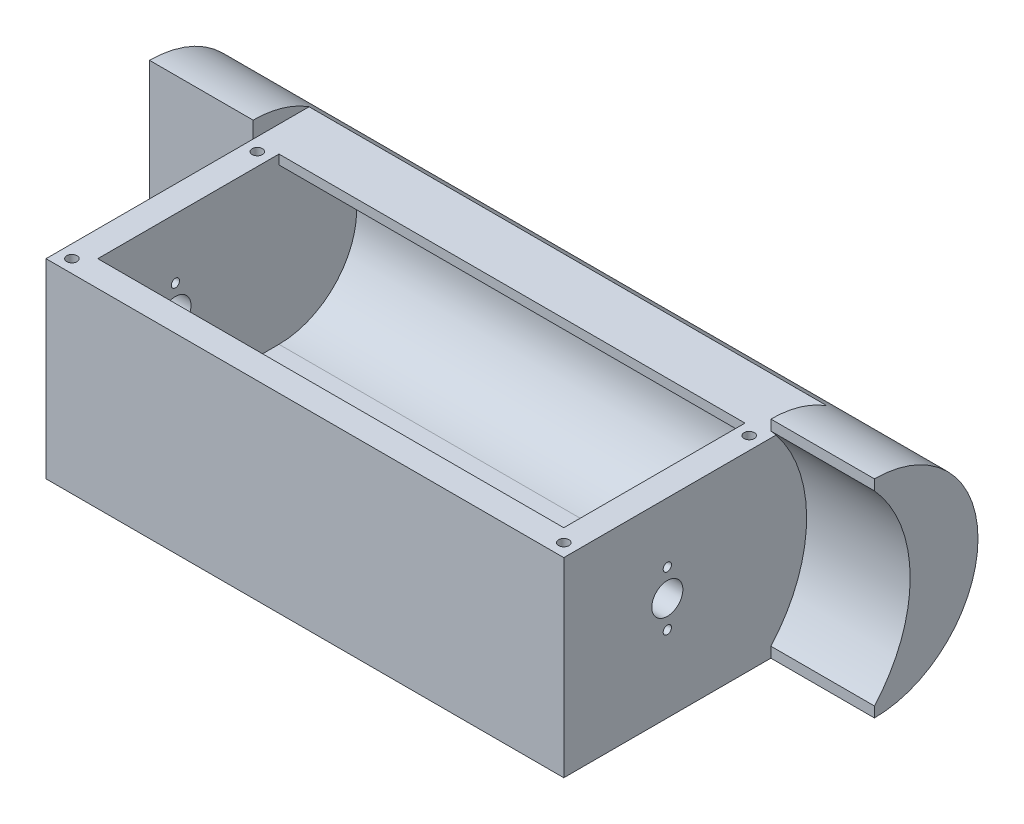
ISO-10303-21;
HEADER;
FILE_DESCRIPTION(('STEP AP214'),'2;1');
FILE_NAME('part.step','',(''),(''),'','','');
FILE_SCHEMA(('AUTOMOTIVE_DESIGN { 1 0 10303 214 1 1 1 1 }'));
ENDSEC;
DATA;
#1=APPLICATION_CONTEXT('core data for automotive mechanical design processes');
#2=APPLICATION_PROTOCOL_DEFINITION('international standard','automotive_design',2000,#1);
#3=PRODUCT_CONTEXT('',#1,'mechanical');
#4=PRODUCT('Part','Part','',(#3));
#5=PRODUCT_RELATED_PRODUCT_CATEGORY('part','',(#4));
#6=PRODUCT_DEFINITION_FORMATION('','',#4);
#7=PRODUCT_DEFINITION_CONTEXT('part definition',#1,'design');
#8=PRODUCT_DEFINITION('design','',#6,#7);
#9=PRODUCT_DEFINITION_SHAPE('','',#8);
#10=(LENGTH_UNIT() NAMED_UNIT(*) SI_UNIT(.MILLI.,.METRE.));
#11=(NAMED_UNIT(*) PLANE_ANGLE_UNIT() SI_UNIT($,.RADIAN.));
#12=(NAMED_UNIT(*) SI_UNIT($,.STERADIAN.) SOLID_ANGLE_UNIT());
#13=UNCERTAINTY_MEASURE_WITH_UNIT(LENGTH_MEASURE(1.E-05),#10,'distance_accuracy_value','');
#14=(GEOMETRIC_REPRESENTATION_CONTEXT(3) GLOBAL_UNCERTAINTY_ASSIGNED_CONTEXT((#13)) GLOBAL_UNIT_ASSIGNED_CONTEXT((#10,
#11,#12)) REPRESENTATION_CONTEXT('',''));
#15=CARTESIAN_POINT('',(0.,0.,0.));
#16=DIRECTION('',(0.,0.,1.));
#17=DIRECTION('',(1.,0.,0.));
#18=AXIS2_PLACEMENT_3D('',#15,#16,#17);
#19=CARTESIAN_POINT('',(120.,20.,-20.));
#20=DIRECTION('',(0.,0.,-1.));
#21=DIRECTION('',(0.,1.,0.));
#22=AXIS2_PLACEMENT_3D('',#19,#20,#21);
#23=PLANE('',#22);
#24=DIRECTION('',(0.,-1.,0.));
#25=VECTOR('',#24,1.);
#26=CARTESIAN_POINT('',(100.,20.,-20.));
#27=LINE('',#26,#25);
#28=CARTESIAN_POINT('',(100.,20.,-20.));
#29=VERTEX_POINT('',#28);
#30=CARTESIAN_POINT('',(100.,17.9891634046723,-20.));
#31=VERTEX_POINT('',#30);
#32=EDGE_CURVE('E189',#29,#31,#27,.T.);
#33=ORIENTED_EDGE('',*,*,#32,.T.);
#34=DIRECTION('',(1.,0.,0.));
#35=VECTOR('',#34,1.);
#36=CARTESIAN_POINT('',(63.365999399465,17.9891634046723,-20.));
#37=LINE('',#36,#35);
#38=CARTESIAN_POINT('',(120.,17.9891634046723,-20.));
#39=VERTEX_POINT('',#38);
#40=EDGE_CURVE('E171',#31,#39,#37,.T.);
#41=ORIENTED_EDGE('',*,*,#40,.T.);
#42=DIRECTION('',(0.,-1.,0.));
#43=VECTOR('',#42,1.);
#44=CARTESIAN_POINT('',(120.,20.,-20.));
#45=LINE('',#44,#43);
#46=CARTESIAN_POINT('',(120.,20.,-20.));
#47=VERTEX_POINT('',#46);
#48=EDGE_CURVE('E201',#47,#39,#45,.T.);
#49=ORIENTED_EDGE('',*,*,#48,.F.);
#50=DIRECTION('',(-1.,0.,0.));
#51=VECTOR('',#50,1.);
#52=CARTESIAN_POINT('',(120.,20.,-20.));
#53=LINE('',#52,#51);
#54=EDGE_CURVE('E206',#47,#29,#53,.T.);
#55=ORIENTED_EDGE('',*,*,#54,.T.);
#56=EDGE_LOOP('',(#33,#41,#49,#55));
#57=FACE_BOUND('',#56,.T.);
#58=ADVANCED_FACE('F49',(#57),#23,.F.);
#59=CARTESIAN_POINT('',(0.,0.,-20.));
#60=DIRECTION('',(-1.,0.,0.));
#61=DIRECTION('',(0.,0.,1.));
#62=AXIS2_PLACEMENT_3D('',#59,#60,#61);
#63=PLANE('',#62);
#64=CARTESIAN_POINT('',(0.,-5.25,0.));
#65=DIRECTION('',(-1.,0.,0.));
#66=DIRECTION('',(0.,0.,1.));
#67=AXIS2_PLACEMENT_3D('',#64,#65,#66);
#68=CIRCLE('',#67,0.8);
#69=CARTESIAN_POINT('',(0.,-5.25,0.799999999999998));
#70=VERTEX_POINT('',#69);
#71=EDGE_CURVE('E276',#70,#70,#68,.F.);
#72=ORIENTED_EDGE('',*,*,#71,.T.);
#73=EDGE_LOOP('',(#72));
#74=FACE_BOUND('',#73,.T.);
#75=CARTESIAN_POINT('',(0.,0.,0.));
#76=DIRECTION('',(-1.,0.,0.));
#77=DIRECTION('',(0.,0.,1.));
#78=AXIS2_PLACEMENT_3D('',#75,#76,#77);
#79=CIRCLE('',#78,3.);
#80=CARTESIAN_POINT('',(0.,0.,3.));
#81=VERTEX_POINT('',#80);
#82=EDGE_CURVE('E410',#81,#81,#79,.F.);
#83=ORIENTED_EDGE('',*,*,#82,.T.);
#84=EDGE_LOOP('',(#83));
#85=FACE_BOUND('',#84,.T.);
#86=CARTESIAN_POINT('',(0.,5.25,0.));
#87=DIRECTION('',(-1.,0.,0.));
#88=DIRECTION('',(0.,0.,1.));
#89=AXIS2_PLACEMENT_3D('',#86,#87,#88);
#90=CIRCLE('',#89,0.8);
#91=CARTESIAN_POINT('',(0.,5.25,0.799999999999998));
#92=VERTEX_POINT('',#91);
#93=EDGE_CURVE('E398',#92,#92,#90,.F.);
#94=ORIENTED_EDGE('',*,*,#93,.T.);
#95=EDGE_LOOP('',(#94));
#96=FACE_BOUND('',#95,.T.);
#97=DIRECTION('',(0.,-1.,0.));
#98=VECTOR('',#97,1.);
#99=CARTESIAN_POINT('',(0.,20.,20.));
#100=LINE('',#99,#98);
#101=CARTESIAN_POINT('',(0.,16.825,20.));
#102=VERTEX_POINT('',#101);
#103=CARTESIAN_POINT('',(0.,-20.,20.));
#104=VERTEX_POINT('',#103);
#105=EDGE_CURVE('E243',#102,#104,#100,.T.);
#106=ORIENTED_EDGE('',*,*,#105,.F.);
#107=DIRECTION('',(0.,0.,1.));
#108=VECTOR('',#107,1.);
#109=CARTESIAN_POINT('',(0.,16.825,-30.81));
#110=LINE('',#109,#108);
#111=CARTESIAN_POINT('',(0.,16.825,-20.));
#112=VERTEX_POINT('',#111);
#113=EDGE_CURVE('E299',#112,#102,#110,.T.);
#114=ORIENTED_EDGE('',*,*,#113,.F.);
#115=DIRECTION('',(0.,-1.,0.));
#116=VECTOR('',#115,1.);
#117=CARTESIAN_POINT('',(0.,20.,-20.));
#118=LINE('',#117,#116);
#119=CARTESIAN_POINT('',(0.,-20.,-20.));
#120=VERTEX_POINT('',#119);
#121=EDGE_CURVE('E341',#112,#120,#118,.T.);
#122=ORIENTED_EDGE('',*,*,#121,.T.);
#123=DIRECTION('',(0.,0.,-1.));
#124=VECTOR('',#123,1.);
#125=CARTESIAN_POINT('',(0.,-20.,20.));
#126=LINE('',#125,#124);
#127=EDGE_CURVE('E254',#104,#120,#126,.T.);
#128=ORIENTED_EDGE('',*,*,#127,.F.);
#129=EDGE_LOOP('',(#106,#114,#122,#128));
#130=FACE_BOUND('',#129,.T.);
#131=ADVANCED_FACE('F427',(#74,#85,#96,#130),#63,.T.);
#132=CARTESIAN_POINT('',(100.,0.,-20.));
#133=DIRECTION('',(-1.,0.,0.));
#134=DIRECTION('',(0.,0.,1.));
#135=AXIS2_PLACEMENT_3D('',#132,#133,#134);
#136=PLANE('',#135);
#137=CARTESIAN_POINT('',(100.,-5.25,0.));
#138=DIRECTION('',(1.,0.,0.));
#139=DIRECTION('',(0.,0.,1.));
#140=AXIS2_PLACEMENT_3D('',#137,#138,#139);
#141=CIRCLE('',#140,0.8);
#142=CARTESIAN_POINT('',(100.,-5.25,0.799999999999998));
#143=VERTEX_POINT('',#142);
#144=EDGE_CURVE('E402',#143,#143,#141,.T.);
#145=ORIENTED_EDGE('',*,*,#144,.F.);
#146=EDGE_LOOP('',(#145));
#147=FACE_BOUND('',#146,.T.);
#148=CARTESIAN_POINT('',(100.,0.,0.));
#149=DIRECTION('',(1.,0.,0.));
#150=DIRECTION('',(0.,0.,-1.));
#151=AXIS2_PLACEMENT_3D('',#148,#149,#150);
#152=CIRCLE('',#151,3.);
#153=CARTESIAN_POINT('',(100.,0.,-3.));
#154=VERTEX_POINT('',#153);
#155=EDGE_CURVE('E406',#154,#154,#152,.T.);
#156=ORIENTED_EDGE('',*,*,#155,.F.);
#157=EDGE_LOOP('',(#156));
#158=FACE_BOUND('',#157,.T.);
#159=CARTESIAN_POINT('',(100.,5.25,0.));
#160=DIRECTION('',(1.,0.,0.));
#161=DIRECTION('',(0.,0.,-1.));
#162=AXIS2_PLACEMENT_3D('',#159,#160,#161);
#163=CIRCLE('',#162,0.8);
#164=CARTESIAN_POINT('',(100.,5.25,-0.800000000000002));
#165=VERTEX_POINT('',#164);
#166=EDGE_CURVE('E292',#165,#165,#163,.T.);
#167=ORIENTED_EDGE('',*,*,#166,.F.);
#168=EDGE_LOOP('',(#167));
#169=FACE_BOUND('',#168,.T.);
#170=DIRECTION('',(0.,0.,-1.));
#171=VECTOR('',#170,1.);
#172=CARTESIAN_POINT('',(100.,16.825,-30.81));
#173=LINE('',#172,#171);
#174=CARTESIAN_POINT('',(100.,16.825,20.));
#175=VERTEX_POINT('',#174);
#176=CARTESIAN_POINT('',(100.,16.825,-20.9887916517364));
#177=VERTEX_POINT('',#176);
#178=EDGE_CURVE('E311',#175,#177,#173,.T.);
#179=ORIENTED_EDGE('',*,*,#178,.F.);
#180=DIRECTION('',(0.,-1.,0.));
#181=VECTOR('',#180,1.);
#182=CARTESIAN_POINT('',(100.,20.,20.));
#183=LINE('',#182,#181);
#184=CARTESIAN_POINT('',(100.,-20.,20.));
#185=VERTEX_POINT('',#184);
#186=EDGE_CURVE('E251',#175,#185,#183,.T.);
#187=ORIENTED_EDGE('',*,*,#186,.T.);
#188=DIRECTION('',(0.,0.,-1.));
#189=VECTOR('',#188,1.);
#190=CARTESIAN_POINT('',(100.,-20.,20.));
#191=LINE('',#190,#189);
#192=CARTESIAN_POINT('',(100.,-20.,-20.));
#193=VERTEX_POINT('',#192);
#194=EDGE_CURVE('E186',#185,#193,#191,.T.);
#195=ORIENTED_EDGE('',*,*,#194,.T.);
#196=CARTESIAN_POINT('',(100.,-17.9891634046723,-20.));
#197=VERTEX_POINT('',#196);
#198=EDGE_CURVE('E177',#197,#193,#27,.T.);
#199=ORIENTED_EDGE('',*,*,#198,.F.);
#200=CARTESIAN_POINT('',(100.,0.,0.));
#201=DIRECTION('',(-1.,0.,0.));
#202=DIRECTION('',(0.,0.,1.));
#203=AXIS2_PLACEMENT_3D('',#200,#201,#202);
#204=CIRCLE('',#203,26.9);
#205=EDGE_CURVE('E67',#197,#177,#204,.F.);
#206=ORIENTED_EDGE('',*,*,#205,.T.);
#207=EDGE_LOOP('',(#179,#187,#195,#199,#206));
#208=FACE_BOUND('',#207,.T.);
#209=ADVANCED_FACE('F184',(#147,#158,#169,#208),#136,.F.);
#210=CARTESIAN_POINT('',(100.,20.,20.));
#211=DIRECTION('',(0.,0.,-1.));
#212=DIRECTION('',(0.,1.,0.));
#213=AXIS2_PLACEMENT_3D('',#210,#211,#212);
#214=PLANE('',#213);
#215=DIRECTION('',(1.,0.,0.));
#216=VECTOR('',#215,1.);
#217=CARTESIAN_POINT('',(0.,16.825,20.));
#218=LINE('',#217,#216);
#219=EDGE_CURVE('E304',#102,#175,#218,.T.);
#220=ORIENTED_EDGE('',*,*,#219,.F.);
#221=ORIENTED_EDGE('',*,*,#105,.T.);
#222=DIRECTION('',(-1.,0.,0.));
#223=VECTOR('',#222,1.);
#224=CARTESIAN_POINT('',(100.,-20.,20.));
#225=LINE('',#224,#223);
#226=EDGE_CURVE('E266',#185,#104,#225,.T.);
#227=ORIENTED_EDGE('',*,*,#226,.F.);
#228=ORIENTED_EDGE('',*,*,#186,.F.);
#229=EDGE_LOOP('',(#220,#221,#227,#228));
#230=FACE_BOUND('',#229,.T.);
#231=ADVANCED_FACE('F51',(#230),#214,.F.);
#232=CARTESIAN_POINT('',(100.,-20.,20.));
#233=DIRECTION('',(0.,1.,0.));
#234=DIRECTION('',(0.,0.,1.));
#235=AXIS2_PLACEMENT_3D('',#232,#233,#234);
#236=PLANE('',#235);
#237=ORIENTED_EDGE('',*,*,#127,.T.);
#238=DIRECTION('',(-1.,0.,0.));
#239=VECTOR('',#238,1.);
#240=CARTESIAN_POINT('',(100.,-20.,-20.));
#241=LINE('',#240,#239);
#242=EDGE_CURVE('E257',#193,#120,#241,.T.);
#243=ORIENTED_EDGE('',*,*,#242,.F.);
#244=ORIENTED_EDGE('',*,*,#194,.F.);
#245=ORIENTED_EDGE('',*,*,#226,.T.);
#246=EDGE_LOOP('',(#237,#243,#244,#245));
#247=FACE_BOUND('',#246,.T.);
#248=ADVANCED_FACE('F434',(#247),#236,.F.);
#249=CARTESIAN_POINT('',(100.,0.,-20.));
#250=DIRECTION('',(-1.,0.,0.));
#251=DIRECTION('',(0.,0.,1.));
#252=AXIS2_PLACEMENT_3D('',#249,#250,#251);
#253=CYLINDRICAL_SURFACE('',#252,20.);
#254=DIRECTION('',(1.,0.,0.));
#255=VECTOR('',#254,1.);
#256=CARTESIAN_POINT('',(-20.,20.,-20.));
#257=LINE('',#256,#255);
#258=CARTESIAN_POINT('',(-20.,20.,-20.));
#259=VERTEX_POINT('',#258);
#260=CARTESIAN_POINT('',(0.,20.,-20.));
#261=VERTEX_POINT('',#260);
#262=EDGE_CURVE('E197',#259,#261,#257,.T.);
#263=ORIENTED_EDGE('',*,*,#262,.T.);
#264=CARTESIAN_POINT('',(0.,0.,-20.));
#265=DIRECTION('',(-1.,0.,0.));
#266=DIRECTION('',(0.,0.,1.));
#267=AXIS2_PLACEMENT_3D('',#264,#265,#266);
#268=CIRCLE('',#267,20.);
#269=CARTESIAN_POINT('',(0.,16.8268802812643,-30.81));
#270=VERTEX_POINT('',#269);
#271=EDGE_CURVE('E321',#261,#270,#268,.T.);
#272=ORIENTED_EDGE('',*,*,#271,.T.);
#273=DIRECTION('',(-1.,0.,0.));
#274=VECTOR('',#273,1.);
#275=CARTESIAN_POINT('',(100.,16.8268802812643,-30.81));
#276=LINE('',#275,#274);
#277=CARTESIAN_POINT('',(100.,16.8268802812643,-30.81));
#278=VERTEX_POINT('',#277);
#279=EDGE_CURVE('E12',#270,#278,#276,.F.);
#280=ORIENTED_EDGE('',*,*,#279,.T.);
#281=CARTESIAN_POINT('',(100.,0.,-20.));
#282=DIRECTION('',(1.,0.,0.));
#283=DIRECTION('',(0.,0.,-1.));
#284=AXIS2_PLACEMENT_3D('',#281,#282,#283);
#285=CIRCLE('',#284,20.);
#286=EDGE_CURVE('E328',#278,#29,#285,.T.);
#287=ORIENTED_EDGE('',*,*,#286,.T.);
#288=ORIENTED_EDGE('',*,*,#54,.F.);
#289=CARTESIAN_POINT('',(120.,0.,-20.));
#290=DIRECTION('',(1.,0.,0.));
#291=DIRECTION('',(0.,0.,1.));
#292=AXIS2_PLACEMENT_3D('',#289,#290,#291);
#293=CIRCLE('',#292,20.);
#294=CARTESIAN_POINT('',(120.,-20.,-20.));
#295=VERTEX_POINT('',#294);
#296=EDGE_CURVE('E195',#295,#47,#293,.T.);
#297=ORIENTED_EDGE('',*,*,#296,.F.);
#298=DIRECTION('',(-1.,0.,0.));
#299=VECTOR('',#298,1.);
#300=CARTESIAN_POINT('',(120.,-20.,-20.));
#301=LINE('',#300,#299);
#302=EDGE_CURVE('E203',#295,#193,#301,.T.);
#303=ORIENTED_EDGE('',*,*,#302,.T.);
#304=ORIENTED_EDGE('',*,*,#242,.T.);
#305=DIRECTION('',(1.,0.,0.));
#306=VECTOR('',#305,1.);
#307=CARTESIAN_POINT('',(-20.,-20.,-20.));
#308=LINE('',#307,#306);
#309=CARTESIAN_POINT('',(-20.,-20.,-20.));
#310=VERTEX_POINT('',#309);
#311=EDGE_CURVE('E190',#310,#120,#308,.T.);
#312=ORIENTED_EDGE('',*,*,#311,.F.);
#313=CARTESIAN_POINT('',(-20.,0.,-20.));
#314=DIRECTION('',(1.,0.,0.));
#315=DIRECTION('',(0.,0.,1.));
#316=AXIS2_PLACEMENT_3D('',#313,#314,#315);
#317=CIRCLE('',#316,20.);
#318=EDGE_CURVE('E342',#310,#259,#317,.T.);
#319=ORIENTED_EDGE('',*,*,#318,.T.);
#320=EDGE_LOOP('',(#263,#272,#280,#287,#288,#297,#303,#304,#312,#319));
#321=FACE_BOUND('',#320,.T.);
#322=ADVANCED_FACE('F448',(#321),#253,.T.);
#323=CARTESIAN_POINT('',(120.,-17.9891634046723,-20.));
#324=VERTEX_POINT('',#323);
#325=EDGE_CURVE('E179',#324,#295,#45,.T.);
#326=ORIENTED_EDGE('',*,*,#325,.F.);
#327=DIRECTION('',(1.,0.,0.));
#328=VECTOR('',#327,1.);
#329=CARTESIAN_POINT('',(63.365999399465,-17.9891634046723,-20.));
#330=LINE('',#329,#328);
#331=EDGE_CURVE('E165',#197,#324,#330,.T.);
#332=ORIENTED_EDGE('',*,*,#331,.F.);
#333=ORIENTED_EDGE('',*,*,#198,.T.);
#334=ORIENTED_EDGE('',*,*,#302,.F.);
#335=EDGE_LOOP('',(#326,#332,#333,#334));
#336=FACE_BOUND('',#335,.T.);
#337=ADVANCED_FACE('F175',(#336),#23,.F.);
#338=CARTESIAN_POINT('',(120.,0.,-20.));
#339=DIRECTION('',(-1.,0.,0.));
#340=DIRECTION('',(0.,0.,1.));
#341=AXIS2_PLACEMENT_3D('',#338,#339,#340);
#342=PLANE('',#341);
#343=ORIENTED_EDGE('',*,*,#48,.T.);
#344=CARTESIAN_POINT('',(120.,0.,0.));
#345=DIRECTION('',(1.,0.,0.));
#346=DIRECTION('',(0.,0.,-1.));
#347=AXIS2_PLACEMENT_3D('',#344,#345,#346);
#348=CIRCLE('',#347,26.9);
#349=EDGE_CURVE('E181',#324,#39,#348,.T.);
#350=ORIENTED_EDGE('',*,*,#349,.F.);
#351=ORIENTED_EDGE('',*,*,#325,.T.);
#352=ORIENTED_EDGE('',*,*,#296,.T.);
#353=EDGE_LOOP('',(#343,#350,#351,#352));
#354=FACE_BOUND('',#353,.T.);
#355=ADVANCED_FACE('F363',(#354),#342,.F.);
#356=CARTESIAN_POINT('',(-20.,20.,-20.));
#357=DIRECTION('',(0.,0.,1.));
#358=DIRECTION('',(0.,-1.,0.));
#359=AXIS2_PLACEMENT_3D('',#356,#357,#358);
#360=PLANE('',#359);
#361=EDGE_CURVE('E347',#261,#112,#118,.T.);
#362=ORIENTED_EDGE('',*,*,#361,.F.);
#363=ORIENTED_EDGE('',*,*,#262,.F.);
#364=DIRECTION('',(0.,-1.,0.));
#365=VECTOR('',#364,1.);
#366=CARTESIAN_POINT('',(-20.,20.,-20.));
#367=LINE('',#366,#365);
#368=EDGE_CURVE('E346',#259,#310,#367,.T.);
#369=ORIENTED_EDGE('',*,*,#368,.T.);
#370=ORIENTED_EDGE('',*,*,#311,.T.);
#371=ORIENTED_EDGE('',*,*,#121,.F.);
#372=EDGE_LOOP('',(#362,#363,#369,#370,#371));
#373=FACE_BOUND('',#372,.T.);
#374=ADVANCED_FACE('F453',(#373),#360,.T.);
#375=CARTESIAN_POINT('',(-20.,0.,-20.));
#376=DIRECTION('',(1.,0.,0.));
#377=DIRECTION('',(0.,0.,1.));
#378=AXIS2_PLACEMENT_3D('',#375,#376,#377);
#379=PLANE('',#378);
#380=ORIENTED_EDGE('',*,*,#318,.F.);
#381=ORIENTED_EDGE('',*,*,#368,.F.);
#382=EDGE_LOOP('',(#380,#381));
#383=FACE_BOUND('',#382,.T.);
#384=ADVANCED_FACE('F555',(#383),#379,.F.);
#385=CARTESIAN_POINT('',(0.,16.825,-30.81));
#386=DIRECTION('',(0.,0.,-1.));
#387=DIRECTION('',(-1.,0.,0.));
#388=AXIS2_PLACEMENT_3D('',#385,#386,#387);
#389=PLANE('',#388);
#390=DIRECTION('',(0.,1.,0.));
#391=VECTOR('',#390,1.);
#392=CARTESIAN_POINT('',(0.,16.825,-30.81));
#393=LINE('',#392,#391);
#394=CARTESIAN_POINT('',(0.,16.825,-30.81));
#395=VERTEX_POINT('',#394);
#396=EDGE_CURVE('E317',#395,#270,#393,.T.);
#397=ORIENTED_EDGE('',*,*,#396,.F.);
#398=DIRECTION('',(-1.,0.,0.));
#399=VECTOR('',#398,1.);
#400=CARTESIAN_POINT('',(0.,16.825,-30.81));
#401=LINE('',#400,#399);
#402=CARTESIAN_POINT('',(100.,16.825,-30.81));
#403=VERTEX_POINT('',#402);
#404=EDGE_CURVE('E312',#403,#395,#401,.T.);
#405=ORIENTED_EDGE('',*,*,#404,.F.);
#406=DIRECTION('',(0.,1.,0.));
#407=VECTOR('',#406,1.);
#408=CARTESIAN_POINT('',(100.,16.825,-30.81));
#409=LINE('',#408,#407);
#410=EDGE_CURVE('E316',#403,#278,#409,.T.);
#411=ORIENTED_EDGE('',*,*,#410,.T.);
#412=ORIENTED_EDGE('',*,*,#279,.F.);
#413=EDGE_LOOP('',(#397,#405,#411,#412));
#414=FACE_BOUND('',#413,.T.);
#415=ADVANCED_FACE('F552',(#414),#389,.F.);
#416=CARTESIAN_POINT('',(100.,16.825,-30.81));
#417=DIRECTION('',(1.,0.,0.));
#418=DIRECTION('',(0.,0.,-1.));
#419=AXIS2_PLACEMENT_3D('',#416,#417,#418);
#420=PLANE('',#419);
#421=EDGE_CURVE('E308',#177,#403,#173,.T.);
#422=ORIENTED_EDGE('',*,*,#421,.F.);
#423=EDGE_CURVE('E168',#177,#31,#204,.F.);
#424=ORIENTED_EDGE('',*,*,#423,.T.);
#425=ORIENTED_EDGE('',*,*,#32,.F.);
#426=ORIENTED_EDGE('',*,*,#286,.F.);
#427=ORIENTED_EDGE('',*,*,#410,.F.);
#428=EDGE_LOOP('',(#422,#424,#425,#426,#427));
#429=FACE_BOUND('',#428,.T.);
#430=ADVANCED_FACE('F547',(#429),#420,.F.);
#431=CARTESIAN_POINT('',(0.,16.825,-30.81));
#432=DIRECTION('',(-1.,0.,0.));
#433=DIRECTION('',(0.,0.,1.));
#434=AXIS2_PLACEMENT_3D('',#431,#432,#433);
#435=PLANE('',#434);
#436=ORIENTED_EDGE('',*,*,#361,.T.);
#437=EDGE_CURVE('E300',#395,#112,#110,.T.);
#438=ORIENTED_EDGE('',*,*,#437,.F.);
#439=ORIENTED_EDGE('',*,*,#396,.T.);
#440=ORIENTED_EDGE('',*,*,#271,.F.);
#441=EDGE_LOOP('',(#436,#438,#439,#440));
#442=FACE_BOUND('',#441,.T.);
#443=ADVANCED_FACE('F467',(#442),#435,.F.);
#444=CARTESIAN_POINT('',(0.,16.825,0.));
#445=DIRECTION('',(0.,1.,0.));
#446=DIRECTION('',(0.,0.,1.));
#447=AXIS2_PLACEMENT_3D('',#444,#445,#446);
#448=PLANE('',#447);
#449=CARTESIAN_POINT('',(97.5,16.825,-18.31));
#450=DIRECTION('',(0.,1.,0.));
#451=DIRECTION('',(0.,0.,1.));
#452=AXIS2_PLACEMENT_3D('',#449,#450,#451);
#453=CIRCLE('',#452,0.999999999999998);
#454=CARTESIAN_POINT('',(97.5,16.825,-17.31));
#455=VERTEX_POINT('',#454);
#456=EDGE_CURVE('E378',#455,#455,#453,.T.);
#457=ORIENTED_EDGE('',*,*,#456,.F.);
#458=EDGE_LOOP('',(#457));
#459=FACE_BOUND('',#458,.T.);
#460=CARTESIAN_POINT('',(2.50000000000002,16.825,17.5));
#461=DIRECTION('',(0.,1.,0.));
#462=DIRECTION('',(0.,0.,-1.));
#463=AXIS2_PLACEMENT_3D('',#460,#461,#462);
#464=CIRCLE('',#463,0.999999999999999);
#465=CARTESIAN_POINT('',(2.50000000000002,16.825,16.5));
#466=VERTEX_POINT('',#465);
#467=EDGE_CURVE('E387',#466,#466,#464,.T.);
#468=ORIENTED_EDGE('',*,*,#467,.F.);
#469=EDGE_LOOP('',(#468));
#470=FACE_BOUND('',#469,.T.);
#471=CARTESIAN_POINT('',(2.50000000000002,16.825,-18.31));
#472=DIRECTION('',(0.,1.,0.));
#473=DIRECTION('',(0.,0.,-1.));
#474=AXIS2_PLACEMENT_3D('',#471,#472,#473);
#475=CIRCLE('',#474,0.999999999999999);
#476=CARTESIAN_POINT('',(2.50000000000002,16.825,-19.31));
#477=VERTEX_POINT('',#476);
#478=EDGE_CURVE('E371',#477,#477,#475,.T.);
#479=ORIENTED_EDGE('',*,*,#478,.F.);
#480=EDGE_LOOP('',(#479));
#481=FACE_BOUND('',#480,.T.);
#482=CARTESIAN_POINT('',(97.5,16.825,17.5));
#483=DIRECTION('',(0.,1.,0.));
#484=DIRECTION('',(0.,0.,1.));
#485=AXIS2_PLACEMENT_3D('',#482,#483,#484);
#486=CIRCLE('',#485,0.999999999999998);
#487=CARTESIAN_POINT('',(97.5,16.825,18.5));
#488=VERTEX_POINT('',#487);
#489=EDGE_CURVE('E382',#488,#488,#486,.T.);
#490=ORIENTED_EDGE('',*,*,#489,.F.);
#491=EDGE_LOOP('',(#490));
#492=FACE_BOUND('',#491,.T.);
#493=DIRECTION('',(1.,0.,0.));
#494=VECTOR('',#493,1.);
#495=CARTESIAN_POINT('',(100.,16.825,15.));
#496=LINE('',#495,#494);
#497=CARTESIAN_POINT('',(5.,16.825,15.));
#498=VERTEX_POINT('',#497);
#499=CARTESIAN_POINT('',(95.,16.825,15.));
#500=VERTEX_POINT('',#499);
#501=EDGE_CURVE('E75',#498,#500,#496,.T.);
#502=ORIENTED_EDGE('',*,*,#501,.F.);
#503=DIRECTION('',(0.,0.,-1.));
#504=VECTOR('',#503,1.);
#505=CARTESIAN_POINT('',(5.,16.825,-20.));
#506=LINE('',#505,#504);
#507=CARTESIAN_POINT('',(5.,16.825,-20.));
#508=VERTEX_POINT('',#507);
#509=EDGE_CURVE('E59',#498,#508,#506,.T.);
#510=ORIENTED_EDGE('',*,*,#509,.T.);
#511=DIRECTION('',(-1.,0.,0.));
#512=VECTOR('',#511,1.);
#513=CARTESIAN_POINT('',(100.,16.825,-20.));
#514=LINE('',#513,#512);
#515=CARTESIAN_POINT('',(95.,16.825,-20.));
#516=VERTEX_POINT('',#515);
#517=EDGE_CURVE('E334',#508,#516,#514,.F.);
#518=ORIENTED_EDGE('',*,*,#517,.T.);
#519=DIRECTION('',(0.,0.,-1.));
#520=VECTOR('',#519,1.);
#521=CARTESIAN_POINT('',(95.,16.825,-20.));
#522=LINE('',#521,#520);
#523=EDGE_CURVE('E337',#500,#516,#522,.T.);
#524=ORIENTED_EDGE('',*,*,#523,.F.);
#525=EDGE_LOOP('',(#502,#510,#518,#524));
#526=FACE_BOUND('',#525,.T.);
#527=ORIENTED_EDGE('',*,*,#437,.T.);
#528=ORIENTED_EDGE('',*,*,#113,.T.);
#529=ORIENTED_EDGE('',*,*,#219,.T.);
#530=ORIENTED_EDGE('',*,*,#178,.T.);
#531=ORIENTED_EDGE('',*,*,#421,.T.);
#532=ORIENTED_EDGE('',*,*,#404,.T.);
#533=EDGE_LOOP('',(#527,#528,#529,#530,#531,#532));
#534=FACE_BOUND('',#533,.T.);
#535=ADVANCED_FACE('F470',(#459,#470,#481,#492,#526,#534),#448,.T.);
#536=CARTESIAN_POINT('',(100.,0.,-20.));
#537=DIRECTION('',(-1.,0.,0.));
#538=DIRECTION('',(0.,0.,1.));
#539=AXIS2_PLACEMENT_3D('',#536,#537,#538);
#540=CYLINDRICAL_SURFACE('',#539,15.);
#541=CARTESIAN_POINT('',(5.,0.,-20.));
#542=DIRECTION('',(-1.,0.,0.));
#543=DIRECTION('',(0.,0.,1.));
#544=AXIS2_PLACEMENT_3D('',#541,#542,#543);
#545=CIRCLE('',#544,15.);
#546=CARTESIAN_POINT('',(5.,-15.,-20.));
#547=VERTEX_POINT('',#546);
#548=CARTESIAN_POINT('',(5.,15.,-20.));
#549=VERTEX_POINT('',#548);
#550=EDGE_CURVE('E224',#547,#549,#545,.F.);
#551=ORIENTED_EDGE('',*,*,#550,.F.);
#552=DIRECTION('',(-1.,0.,0.));
#553=VECTOR('',#552,1.);
#554=CARTESIAN_POINT('',(100.,-15.,-20.));
#555=LINE('',#554,#553);
#556=CARTESIAN_POINT('',(95.,-15.,-20.));
#557=VERTEX_POINT('',#556);
#558=EDGE_CURVE('E219',#557,#547,#555,.T.);
#559=ORIENTED_EDGE('',*,*,#558,.F.);
#560=CARTESIAN_POINT('',(95.,0.,-20.));
#561=DIRECTION('',(-1.,0.,0.));
#562=DIRECTION('',(0.,0.,1.));
#563=AXIS2_PLACEMENT_3D('',#560,#561,#562);
#564=CIRCLE('',#563,15.);
#565=CARTESIAN_POINT('',(95.,15.,-20.));
#566=VERTEX_POINT('',#565);
#567=EDGE_CURVE('E230',#557,#566,#564,.F.);
#568=ORIENTED_EDGE('',*,*,#567,.T.);
#569=DIRECTION('',(-1.,0.,0.));
#570=VECTOR('',#569,1.);
#571=CARTESIAN_POINT('',(50.,15.,-20.));
#572=LINE('',#571,#570);
#573=EDGE_CURVE('E218',#566,#549,#572,.T.);
#574=ORIENTED_EDGE('',*,*,#573,.T.);
#575=EDGE_LOOP('',(#551,#559,#568,#574));
#576=FACE_BOUND('',#575,.T.);
#577=ADVANCED_FACE('F534',(#576),#540,.F.);
#578=CARTESIAN_POINT('',(100.,-15.,20.));
#579=DIRECTION('',(0.,1.,0.));
#580=DIRECTION('',(0.,0.,1.));
#581=AXIS2_PLACEMENT_3D('',#578,#579,#580);
#582=PLANE('',#581);
#583=DIRECTION('',(0.,0.,-1.));
#584=VECTOR('',#583,1.);
#585=CARTESIAN_POINT('',(5.,-15.,-20.));
#586=LINE('',#585,#584);
#587=CARTESIAN_POINT('',(5.,-15.,15.));
#588=VERTEX_POINT('',#587);
#589=EDGE_CURVE('E213',#588,#547,#586,.T.);
#590=ORIENTED_EDGE('',*,*,#589,.F.);
#591=DIRECTION('',(-1.,0.,0.));
#592=VECTOR('',#591,1.);
#593=CARTESIAN_POINT('',(100.,-15.,15.));
#594=LINE('',#593,#592);
#595=CARTESIAN_POINT('',(95.,-15.,15.));
#596=VERTEX_POINT('',#595);
#597=EDGE_CURVE('E214',#596,#588,#594,.T.);
#598=ORIENTED_EDGE('',*,*,#597,.F.);
#599=DIRECTION('',(0.,0.,-1.));
#600=VECTOR('',#599,1.);
#601=CARTESIAN_POINT('',(95.,-15.,-20.));
#602=LINE('',#601,#600);
#603=EDGE_CURVE('E223',#596,#557,#602,.T.);
#604=ORIENTED_EDGE('',*,*,#603,.T.);
#605=ORIENTED_EDGE('',*,*,#558,.T.);
#606=EDGE_LOOP('',(#590,#598,#604,#605));
#607=FACE_BOUND('',#606,.T.);
#608=ADVANCED_FACE('F516',(#607),#582,.T.);
#609=CARTESIAN_POINT('',(95.,0.,-20.));
#610=DIRECTION('',(-1.,0.,0.));
#611=DIRECTION('',(0.,0.,1.));
#612=AXIS2_PLACEMENT_3D('',#609,#610,#611);
#613=PLANE('',#612);
#614=CARTESIAN_POINT('',(95.,-5.25,0.));
#615=DIRECTION('',(-1.,0.,0.));
#616=DIRECTION('',(0.,0.,1.));
#617=AXIS2_PLACEMENT_3D('',#614,#615,#616);
#618=CIRCLE('',#617,0.8);
#619=CARTESIAN_POINT('',(95.,-5.25,0.799999999999998));
#620=VERTEX_POINT('',#619);
#621=EDGE_CURVE('E295',#620,#620,#618,.T.);
#622=ORIENTED_EDGE('',*,*,#621,.F.);
#623=EDGE_LOOP('',(#622));
#624=FACE_BOUND('',#623,.T.);
#625=CARTESIAN_POINT('',(95.,0.,0.));
#626=DIRECTION('',(-1.,0.,0.));
#627=DIRECTION('',(0.,0.,1.));
#628=AXIS2_PLACEMENT_3D('',#625,#626,#627);
#629=CIRCLE('',#628,3.);
#630=CARTESIAN_POINT('',(95.,0.,3.));
#631=VERTEX_POINT('',#630);
#632=EDGE_CURVE('E280',#631,#631,#629,.T.);
#633=ORIENTED_EDGE('',*,*,#632,.F.);
#634=EDGE_LOOP('',(#633));
#635=FACE_BOUND('',#634,.T.);
#636=CARTESIAN_POINT('',(95.,5.25,0.));
#637=DIRECTION('',(-1.,0.,0.));
#638=DIRECTION('',(0.,0.,1.));
#639=AXIS2_PLACEMENT_3D('',#636,#637,#638);
#640=CIRCLE('',#639,0.8);
#641=CARTESIAN_POINT('',(95.,5.25,0.799999999999998));
#642=VERTEX_POINT('',#641);
#643=EDGE_CURVE('E275',#642,#642,#640,.T.);
#644=ORIENTED_EDGE('',*,*,#643,.F.);
#645=EDGE_LOOP('',(#644));
#646=FACE_BOUND('',#645,.T.);
#647=DIRECTION('',(0.,-1.,0.));
#648=VECTOR('',#647,1.);
#649=CARTESIAN_POINT('',(95.,0.,15.));
#650=LINE('',#649,#648);
#651=EDGE_CURVE('E220',#500,#596,#650,.T.);
#652=ORIENTED_EDGE('',*,*,#651,.F.);
#653=ORIENTED_EDGE('',*,*,#523,.T.);
#654=DIRECTION('',(0.,-1.,0.));
#655=VECTOR('',#654,1.);
#656=CARTESIAN_POINT('',(95.,20.,-20.));
#657=LINE('',#656,#655);
#658=EDGE_CURVE('E239',#566,#516,#657,.F.);
#659=ORIENTED_EDGE('',*,*,#658,.F.);
#660=ORIENTED_EDGE('',*,*,#567,.F.);
#661=ORIENTED_EDGE('',*,*,#603,.F.);
#662=EDGE_LOOP('',(#652,#653,#659,#660,#661));
#663=FACE_BOUND('',#662,.T.);
#664=ADVANCED_FACE('F513',(#624,#635,#646,#663),#613,.T.);
#665=CARTESIAN_POINT('',(5.,0.,-20.));
#666=DIRECTION('',(-1.,0.,0.));
#667=DIRECTION('',(0.,0.,1.));
#668=AXIS2_PLACEMENT_3D('',#665,#666,#667);
#669=PLANE('',#668);
#670=CARTESIAN_POINT('',(5.,-5.25,0.));
#671=DIRECTION('',(-1.,0.,0.));
#672=DIRECTION('',(0.,0.,1.));
#673=AXIS2_PLACEMENT_3D('',#670,#671,#672);
#674=CIRCLE('',#673,0.8);
#675=CARTESIAN_POINT('',(5.,-5.25,0.799999999999998));
#676=VERTEX_POINT('',#675);
#677=EDGE_CURVE('E53',#676,#676,#674,.T.);
#678=ORIENTED_EDGE('',*,*,#677,.T.);
#679=EDGE_LOOP('',(#678));
#680=FACE_BOUND('',#679,.T.);
#681=CARTESIAN_POINT('',(5.,0.,0.));
#682=DIRECTION('',(-1.,0.,0.));
#683=DIRECTION('',(0.,0.,1.));
#684=AXIS2_PLACEMENT_3D('',#681,#682,#683);
#685=CIRCLE('',#684,3.);
#686=CARTESIAN_POINT('',(5.,0.,3.));
#687=VERTEX_POINT('',#686);
#688=EDGE_CURVE('E277',#687,#687,#685,.T.);
#689=ORIENTED_EDGE('',*,*,#688,.T.);
#690=EDGE_LOOP('',(#689));
#691=FACE_BOUND('',#690,.T.);
#692=CARTESIAN_POINT('',(5.,5.25,0.));
#693=DIRECTION('',(-1.,0.,0.));
#694=DIRECTION('',(0.,0.,1.));
#695=AXIS2_PLACEMENT_3D('',#692,#693,#694);
#696=CIRCLE('',#695,0.8);
#697=CARTESIAN_POINT('',(5.,5.25,0.799999999999998));
#698=VERTEX_POINT('',#697);
#699=EDGE_CURVE('E272',#698,#698,#696,.T.);
#700=ORIENTED_EDGE('',*,*,#699,.T.);
#701=EDGE_LOOP('',(#700));
#702=FACE_BOUND('',#701,.T.);
#703=ORIENTED_EDGE('',*,*,#509,.F.);
#704=DIRECTION('',(0.,-1.,0.));
#705=VECTOR('',#704,1.);
#706=CARTESIAN_POINT('',(5.,0.,15.));
#707=LINE('',#706,#705);
#708=EDGE_CURVE('E210',#498,#588,#707,.T.);
#709=ORIENTED_EDGE('',*,*,#708,.T.);
#710=ORIENTED_EDGE('',*,*,#589,.T.);
#711=ORIENTED_EDGE('',*,*,#550,.T.);
#712=DIRECTION('',(0.,-1.,0.));
#713=VECTOR('',#712,1.);
#714=CARTESIAN_POINT('',(5.,20.,-20.));
#715=LINE('',#714,#713);
#716=EDGE_CURVE('E244',#549,#508,#715,.F.);
#717=ORIENTED_EDGE('',*,*,#716,.T.);
#718=EDGE_LOOP('',(#703,#709,#710,#711,#717));
#719=FACE_BOUND('',#718,.T.);
#720=ADVANCED_FACE('F481',(#680,#691,#702,#719),#669,.F.);
#721=CARTESIAN_POINT('',(100.,20.,15.));
#722=DIRECTION('',(0.,0.,-1.));
#723=DIRECTION('',(0.,1.,0.));
#724=AXIS2_PLACEMENT_3D('',#721,#722,#723);
#725=PLANE('',#724);
#726=ORIENTED_EDGE('',*,*,#708,.F.);
#727=ORIENTED_EDGE('',*,*,#501,.T.);
#728=ORIENTED_EDGE('',*,*,#651,.T.);
#729=ORIENTED_EDGE('',*,*,#597,.T.);
#730=EDGE_LOOP('',(#726,#727,#728,#729));
#731=FACE_BOUND('',#730,.T.);
#732=ADVANCED_FACE('F527',(#731),#725,.T.);
#733=CARTESIAN_POINT('',(100.,20.,-20.));
#734=DIRECTION('',(0.,0.,1.));
#735=DIRECTION('',(-1.,0.,0.));
#736=AXIS2_PLACEMENT_3D('',#733,#734,#735);
#737=PLANE('',#736);
#738=ORIENTED_EDGE('',*,*,#517,.F.);
#739=ORIENTED_EDGE('',*,*,#716,.F.);
#740=ORIENTED_EDGE('',*,*,#573,.F.);
#741=ORIENTED_EDGE('',*,*,#658,.T.);
#742=EDGE_LOOP('',(#738,#739,#740,#741));
#743=FACE_BOUND('',#742,.T.);
#744=ADVANCED_FACE('F538',(#743),#737,.T.);
#745=CARTESIAN_POINT('',(-8.48528137423857,5.25,0.));
#746=DIRECTION('',(1.,0.,0.));
#747=DIRECTION('',(0.,0.,-1.));
#748=AXIS2_PLACEMENT_3D('',#745,#746,#747);
#749=CYLINDRICAL_SURFACE('',#748,0.8);
#750=ORIENTED_EDGE('',*,*,#93,.F.);
#751=EDGE_LOOP('',(#750));
#752=FACE_BOUND('',#751,.T.);
#753=ORIENTED_EDGE('',*,*,#699,.F.);
#754=EDGE_LOOP('',(#753));
#755=FACE_BOUND('',#754,.T.);
#756=ADVANCED_FACE('F495',(#752,#755),#749,.F.);
#757=CARTESIAN_POINT('',(-8.48528137423857,0.,0.));
#758=DIRECTION('',(1.,0.,0.));
#759=DIRECTION('',(0.,0.,-1.));
#760=AXIS2_PLACEMENT_3D('',#757,#758,#759);
#761=CYLINDRICAL_SURFACE('',#760,3.);
#762=ORIENTED_EDGE('',*,*,#82,.F.);
#763=EDGE_LOOP('',(#762));
#764=FACE_BOUND('',#763,.T.);
#765=ORIENTED_EDGE('',*,*,#688,.F.);
#766=EDGE_LOOP('',(#765));
#767=FACE_BOUND('',#766,.T.);
#768=ADVANCED_FACE('F485',(#764,#767),#761,.F.);
#769=CARTESIAN_POINT('',(-8.48528137423857,-5.25,0.));
#770=DIRECTION('',(1.,0.,0.));
#771=DIRECTION('',(0.,0.,-1.));
#772=AXIS2_PLACEMENT_3D('',#769,#770,#771);
#773=CYLINDRICAL_SURFACE('',#772,0.8);
#774=ORIENTED_EDGE('',*,*,#71,.F.);
#775=EDGE_LOOP('',(#774));
#776=FACE_BOUND('',#775,.T.);
#777=ORIENTED_EDGE('',*,*,#677,.F.);
#778=EDGE_LOOP('',(#777));
#779=FACE_BOUND('',#778,.T.);
#780=ADVANCED_FACE('F483',(#776,#779),#773,.F.);
#781=ORIENTED_EDGE('',*,*,#643,.T.);
#782=EDGE_LOOP('',(#781));
#783=FACE_BOUND('',#782,.T.);
#784=ORIENTED_EDGE('',*,*,#166,.T.);
#785=EDGE_LOOP('',(#784));
#786=FACE_BOUND('',#785,.T.);
#787=ADVANCED_FACE('F424',(#783,#786),#749,.F.);
#788=ORIENTED_EDGE('',*,*,#632,.T.);
#789=EDGE_LOOP('',(#788));
#790=FACE_BOUND('',#789,.T.);
#791=ORIENTED_EDGE('',*,*,#155,.T.);
#792=EDGE_LOOP('',(#791));
#793=FACE_BOUND('',#792,.T.);
#794=ADVANCED_FACE('F493',(#790,#793),#761,.F.);
#795=ORIENTED_EDGE('',*,*,#621,.T.);
#796=EDGE_LOOP('',(#795));
#797=FACE_BOUND('',#796,.T.);
#798=ORIENTED_EDGE('',*,*,#144,.T.);
#799=EDGE_LOOP('',(#798));
#800=FACE_BOUND('',#799,.T.);
#801=ADVANCED_FACE('F488',(#797,#800),#773,.F.);
#802=CARTESIAN_POINT('',(97.5,13.825,17.5));
#803=DIRECTION('',(0.,1.,0.));
#804=DIRECTION('',(0.,0.,1.));
#805=AXIS2_PLACEMENT_3D('',#802,#803,#804);
#806=CYLINDRICAL_SURFACE('',#805,0.999999999999998);
#807=CARTESIAN_POINT('',(97.5,13.825,17.5));
#808=DIRECTION('',(0.,1.,0.));
#809=DIRECTION('',(0.,0.,1.));
#810=AXIS2_PLACEMENT_3D('',#807,#808,#809);
#811=CIRCLE('',#810,0.999999999999998);
#812=CARTESIAN_POINT('',(97.5,13.825,18.5));
#813=VERTEX_POINT('',#812);
#814=EDGE_CURVE('E394',#813,#813,#811,.T.);
#815=ORIENTED_EDGE('',*,*,#814,.F.);
#816=EDGE_LOOP('',(#815));
#817=FACE_BOUND('',#816,.T.);
#818=ORIENTED_EDGE('',*,*,#489,.T.);
#819=EDGE_LOOP('',(#818));
#820=FACE_BOUND('',#819,.T.);
#821=ADVANCED_FACE('F501',(#817,#820),#806,.F.);
#822=CARTESIAN_POINT('',(97.5,13.825,17.5));
#823=DIRECTION('',(0.,1.,0.));
#824=DIRECTION('',(0.,0.,1.));
#825=AXIS2_PLACEMENT_3D('',#822,#823,#824);
#826=PLANE('',#825);
#827=ORIENTED_EDGE('',*,*,#814,.T.);
#828=EDGE_LOOP('',(#827));
#829=FACE_BOUND('',#828,.T.);
#830=ADVANCED_FACE('F507',(#829),#826,.T.);
#831=CARTESIAN_POINT('',(2.50000000000002,13.825,-18.31));
#832=DIRECTION('',(0.,1.,0.));
#833=DIRECTION('',(0.,0.,1.));
#834=AXIS2_PLACEMENT_3D('',#831,#832,#833);
#835=CYLINDRICAL_SURFACE('',#834,0.999999999999999);
#836=CARTESIAN_POINT('',(2.50000000000002,13.825,-18.31));
#837=DIRECTION('',(0.,1.,0.));
#838=DIRECTION('',(0.,0.,-1.));
#839=AXIS2_PLACEMENT_3D('',#836,#837,#838);
#840=CIRCLE('',#839,0.999999999999999);
#841=CARTESIAN_POINT('',(2.50000000000002,13.825,-19.31));
#842=VERTEX_POINT('',#841);
#843=EDGE_CURVE('E367',#842,#842,#840,.T.);
#844=ORIENTED_EDGE('',*,*,#843,.F.);
#845=EDGE_LOOP('',(#844));
#846=FACE_BOUND('',#845,.T.);
#847=ORIENTED_EDGE('',*,*,#478,.T.);
#848=EDGE_LOOP('',(#847));
#849=FACE_BOUND('',#848,.T.);
#850=ADVANCED_FACE('F685',(#846,#849),#835,.F.);
#851=CARTESIAN_POINT('',(2.50000000000002,13.825,-18.31));
#852=DIRECTION('',(0.,-1.,0.));
#853=DIRECTION('',(0.,0.,-1.));
#854=AXIS2_PLACEMENT_3D('',#851,#852,#853);
#855=PLANE('',#854);
#856=ORIENTED_EDGE('',*,*,#843,.T.);
#857=EDGE_LOOP('',(#856));
#858=FACE_BOUND('',#857,.T.);
#859=ADVANCED_FACE('F696',(#858),#855,.F.);
#860=CARTESIAN_POINT('',(2.50000000000002,13.825,17.5));
#861=DIRECTION('',(0.,1.,0.));
#862=DIRECTION('',(0.,0.,1.));
#863=AXIS2_PLACEMENT_3D('',#860,#861,#862);
#864=CYLINDRICAL_SURFACE('',#863,0.999999999999999);
#865=CARTESIAN_POINT('',(2.50000000000002,13.825,17.5));
#866=DIRECTION('',(0.,1.,0.));
#867=DIRECTION('',(0.,0.,-1.));
#868=AXIS2_PLACEMENT_3D('',#865,#866,#867);
#869=CIRCLE('',#868,0.999999999999999);
#870=CARTESIAN_POINT('',(2.50000000000002,13.825,16.5));
#871=VERTEX_POINT('',#870);
#872=EDGE_CURVE('E376',#871,#871,#869,.T.);
#873=ORIENTED_EDGE('',*,*,#872,.F.);
#874=EDGE_LOOP('',(#873));
#875=FACE_BOUND('',#874,.T.);
#876=ORIENTED_EDGE('',*,*,#467,.T.);
#877=EDGE_LOOP('',(#876));
#878=FACE_BOUND('',#877,.T.);
#879=ADVANCED_FACE('F707',(#875,#878),#864,.F.);
#880=CARTESIAN_POINT('',(2.50000000000002,13.825,17.5));
#881=DIRECTION('',(0.,-1.,0.));
#882=DIRECTION('',(0.,0.,-1.));
#883=AXIS2_PLACEMENT_3D('',#880,#881,#882);
#884=PLANE('',#883);
#885=ORIENTED_EDGE('',*,*,#872,.T.);
#886=EDGE_LOOP('',(#885));
#887=FACE_BOUND('',#886,.T.);
#888=ADVANCED_FACE('F718',(#887),#884,.F.);
#889=CARTESIAN_POINT('',(97.5,13.825,-18.31));
#890=DIRECTION('',(0.,1.,0.));
#891=DIRECTION('',(0.,0.,1.));
#892=AXIS2_PLACEMENT_3D('',#889,#890,#891);
#893=CYLINDRICAL_SURFACE('',#892,0.999999999999998);
#894=CARTESIAN_POINT('',(97.5,13.825,-18.31));
#895=DIRECTION('',(0.,1.,0.));
#896=DIRECTION('',(0.,0.,1.));
#897=AXIS2_PLACEMENT_3D('',#894,#895,#896);
#898=CIRCLE('',#897,0.999999999999998);
#899=CARTESIAN_POINT('',(97.5,13.825,-17.31));
#900=VERTEX_POINT('',#899);
#901=EDGE_CURVE('E383',#900,#900,#898,.T.);
#902=ORIENTED_EDGE('',*,*,#901,.F.);
#903=EDGE_LOOP('',(#902));
#904=FACE_BOUND('',#903,.T.);
#905=ORIENTED_EDGE('',*,*,#456,.T.);
#906=EDGE_LOOP('',(#905));
#907=FACE_BOUND('',#906,.T.);
#908=ADVANCED_FACE('F729',(#904,#907),#893,.F.);
#909=CARTESIAN_POINT('',(97.5,13.825,-18.31));
#910=DIRECTION('',(0.,1.,0.));
#911=DIRECTION('',(0.,0.,1.));
#912=AXIS2_PLACEMENT_3D('',#909,#910,#911);
#913=PLANE('',#912);
#914=ORIENTED_EDGE('',*,*,#901,.T.);
#915=EDGE_LOOP('',(#914));
#916=FACE_BOUND('',#915,.T.);
#917=ADVANCED_FACE('F740',(#916),#913,.T.);
#918=CARTESIAN_POINT('',(63.365999399465,0.,0.));
#919=DIRECTION('',(1.,0.,0.));
#920=DIRECTION('',(0.,0.,-1.));
#921=AXIS2_PLACEMENT_3D('',#918,#919,#920);
#922=CYLINDRICAL_SURFACE('',#921,26.9);
#923=ORIENTED_EDGE('',*,*,#331,.T.);
#924=ORIENTED_EDGE('',*,*,#349,.T.);
#925=ORIENTED_EDGE('',*,*,#40,.F.);
#926=ORIENTED_EDGE('',*,*,#423,.F.);
#927=ORIENTED_EDGE('',*,*,#205,.F.);
#928=EDGE_LOOP('',(#923,#924,#925,#926,#927));
#929=FACE_BOUND('',#928,.T.);
#930=ADVANCED_FACE('F164',(#929),#922,.F.);
#931=CLOSED_SHELL('',(#58,#131,#209,#231,#248,#322,#337,#355,#374,#384,#415,#430,#443,#535,#577,
#608,#664,#720,#732,#744,#756,#768,#780,#787,#794,#801,#821,#830,#850,#859,#879,#888,#908,#917,#930));
#932=MANIFOLD_SOLID_BREP('B2',#931);
#933=ADVANCED_BREP_SHAPE_REPRESENTATION('',(#18,#932),#14);
#934=SHAPE_DEFINITION_REPRESENTATION(#9,#933);
ENDSEC;
END-ISO-10303-21;
